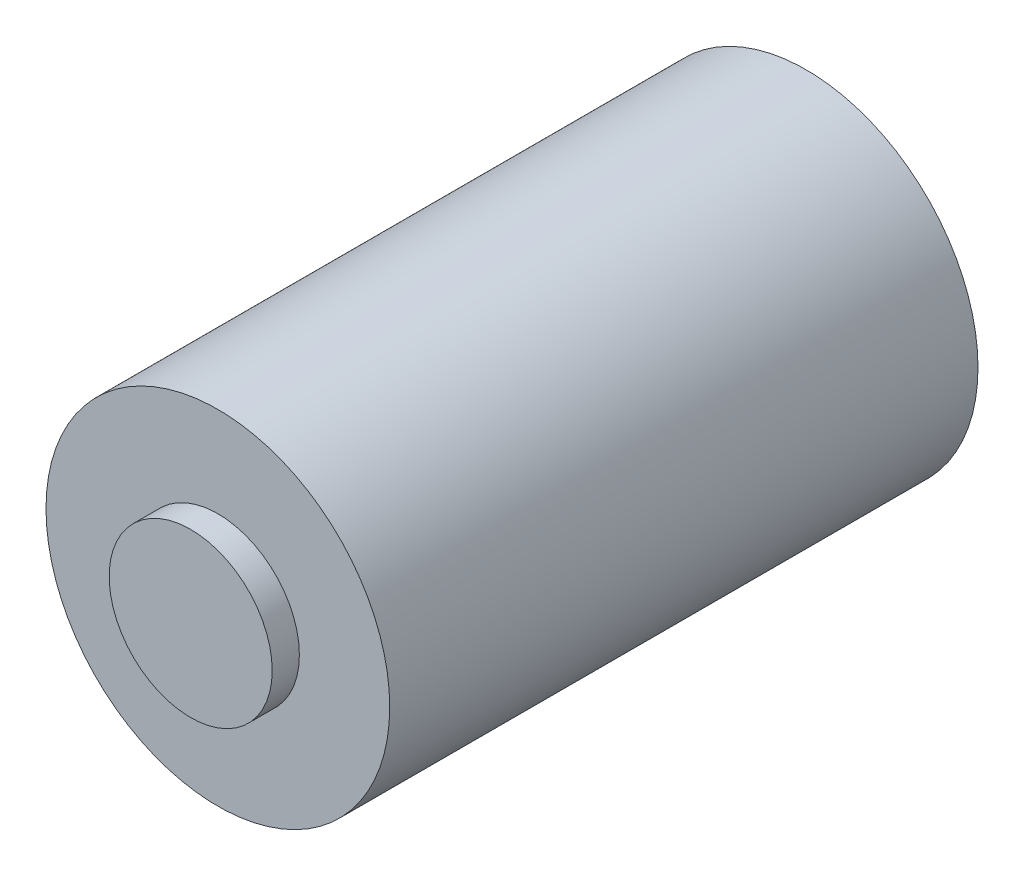
ISO-10303-21;
HEADER;
FILE_DESCRIPTION(('STEP AP214'),'2;1');
FILE_NAME('part.step','',(''),(''),'','','');
FILE_SCHEMA(('AUTOMOTIVE_DESIGN { 1 0 10303 214 1 1 1 1 }'));
ENDSEC;
DATA;
#1=APPLICATION_CONTEXT('core data for automotive mechanical design processes');
#2=APPLICATION_PROTOCOL_DEFINITION('international standard','automotive_design',2000,#1);
#3=PRODUCT_CONTEXT('',#1,'mechanical');
#4=PRODUCT('Part','Part','',(#3));
#5=PRODUCT_RELATED_PRODUCT_CATEGORY('part','',(#4));
#6=PRODUCT_DEFINITION_FORMATION('','',#4);
#7=PRODUCT_DEFINITION_CONTEXT('part definition',#1,'design');
#8=PRODUCT_DEFINITION('design','',#6,#7);
#9=PRODUCT_DEFINITION_SHAPE('','',#8);
#10=(LENGTH_UNIT() NAMED_UNIT(*) SI_UNIT(.MILLI.,.METRE.));
#11=(NAMED_UNIT(*) PLANE_ANGLE_UNIT() SI_UNIT($,.RADIAN.));
#12=(NAMED_UNIT(*) SI_UNIT($,.STERADIAN.) SOLID_ANGLE_UNIT());
#13=UNCERTAINTY_MEASURE_WITH_UNIT(LENGTH_MEASURE(1.E-05),#10,'distance_accuracy_value','');
#14=(GEOMETRIC_REPRESENTATION_CONTEXT(3) GLOBAL_UNCERTAINTY_ASSIGNED_CONTEXT((#13)) GLOBAL_UNIT_ASSIGNED_CONTEXT((#10,
#11,#12)) REPRESENTATION_CONTEXT('',''));
#15=CARTESIAN_POINT('',(0.,0.,0.));
#16=DIRECTION('',(0.,0.,1.));
#17=DIRECTION('',(1.,0.,0.));
#18=AXIS2_PLACEMENT_3D('',#15,#16,#17);
#19=CARTESIAN_POINT('',(0.,0.,109.982));
#20=DIRECTION('',(0.,0.,-1.));
#21=DIRECTION('',(-1.,0.,0.));
#22=AXIS2_PLACEMENT_3D('',#19,#20,#21);
#23=CYLINDRICAL_SURFACE('',#22,32.131);
#24=CARTESIAN_POINT('',(0.,0.,109.982));
#25=DIRECTION('',(0.,0.,1.));
#26=DIRECTION('',(1.,0.,0.));
#27=AXIS2_PLACEMENT_3D('',#24,#25,#26);
#28=CIRCLE('',#27,32.131);
#29=CARTESIAN_POINT('',(32.131,0.,109.982));
#30=VERTEX_POINT('',#29);
#31=EDGE_CURVE('E10',#30,#30,#28,.T.);
#32=ORIENTED_EDGE('',*,*,#31,.F.);
#33=EDGE_LOOP('',(#32));
#34=FACE_BOUND('',#33,.T.);
#35=CARTESIAN_POINT('',(0.,0.,0.));
#36=DIRECTION('',(0.,0.,1.));
#37=DIRECTION('',(1.,0.,0.));
#38=AXIS2_PLACEMENT_3D('',#35,#36,#37);
#39=CIRCLE('',#38,32.131);
#40=CARTESIAN_POINT('',(32.131,0.,0.));
#41=VERTEX_POINT('',#40);
#42=EDGE_CURVE('E37',#41,#41,#39,.T.);
#43=ORIENTED_EDGE('',*,*,#42,.T.);
#44=EDGE_LOOP('',(#43));
#45=FACE_BOUND('',#44,.T.);
#46=ADVANCED_FACE('F34',(#34,#45),#23,.T.);
#47=CARTESIAN_POINT('',(0.,0.,109.982));
#48=DIRECTION('',(0.,0.,1.));
#49=DIRECTION('',(1.,0.,0.));
#50=AXIS2_PLACEMENT_3D('',#47,#48,#49);
#51=PLANE('',#50);
#52=CARTESIAN_POINT('',(0.,0.,109.982));
#53=DIRECTION('',(0.,0.,1.));
#54=DIRECTION('',(1.,0.,0.));
#55=AXIS2_PLACEMENT_3D('',#52,#53,#54);
#56=CIRCLE('',#55,15.24);
#57=CARTESIAN_POINT('',(15.24,0.,109.982));
#58=VERTEX_POINT('',#57);
#59=EDGE_CURVE('E49',#58,#58,#56,.T.);
#60=ORIENTED_EDGE('',*,*,#59,.F.);
#61=EDGE_LOOP('',(#60));
#62=FACE_BOUND('',#61,.T.);
#63=ORIENTED_EDGE('',*,*,#31,.T.);
#64=EDGE_LOOP('',(#63));
#65=FACE_BOUND('',#64,.T.);
#66=ADVANCED_FACE('F65',(#62,#65),#51,.T.);
#67=CARTESIAN_POINT('',(0.,0.,0.));
#68=DIRECTION('',(0.,0.,1.));
#69=DIRECTION('',(1.,0.,0.));
#70=AXIS2_PLACEMENT_3D('',#67,#68,#69);
#71=PLANE('',#70);
#72=ORIENTED_EDGE('',*,*,#42,.F.);
#73=EDGE_LOOP('',(#72));
#74=FACE_BOUND('',#73,.T.);
#75=ADVANCED_FACE('F61',(#74),#71,.F.);
#76=CARTESIAN_POINT('',(0.,0.,115.062));
#77=DIRECTION('',(0.,0.,-1.));
#78=DIRECTION('',(-1.,0.,0.));
#79=AXIS2_PLACEMENT_3D('',#76,#77,#78);
#80=CYLINDRICAL_SURFACE('',#79,15.24);
#81=CARTESIAN_POINT('',(0.,0.,115.062));
#82=DIRECTION('',(0.,0.,1.));
#83=DIRECTION('',(1.,0.,0.));
#84=AXIS2_PLACEMENT_3D('',#81,#82,#83);
#85=CIRCLE('',#84,15.24);
#86=CARTESIAN_POINT('',(15.24,0.,115.062));
#87=VERTEX_POINT('',#86);
#88=EDGE_CURVE('E47',#87,#87,#85,.T.);
#89=ORIENTED_EDGE('',*,*,#88,.F.);
#90=EDGE_LOOP('',(#89));
#91=FACE_BOUND('',#90,.T.);
#92=ORIENTED_EDGE('',*,*,#59,.T.);
#93=EDGE_LOOP('',(#92));
#94=FACE_BOUND('',#93,.T.);
#95=ADVANCED_FACE('F58',(#91,#94),#80,.T.);
#96=CARTESIAN_POINT('',(0.,0.,115.062));
#97=DIRECTION('',(0.,0.,1.));
#98=DIRECTION('',(1.,0.,0.));
#99=AXIS2_PLACEMENT_3D('',#96,#97,#98);
#100=PLANE('',#99);
#101=ORIENTED_EDGE('',*,*,#88,.T.);
#102=EDGE_LOOP('',(#101));
#103=FACE_BOUND('',#102,.T.);
#104=ADVANCED_FACE('F56',(#103),#100,.T.);
#105=CLOSED_SHELL('',(#46,#66,#75,#95,#104));
#106=MANIFOLD_SOLID_BREP('B2',#105);
#107=ADVANCED_BREP_SHAPE_REPRESENTATION('',(#18,#106),#14);
#108=SHAPE_DEFINITION_REPRESENTATION(#9,#107);
ENDSEC;
END-ISO-10303-21;
